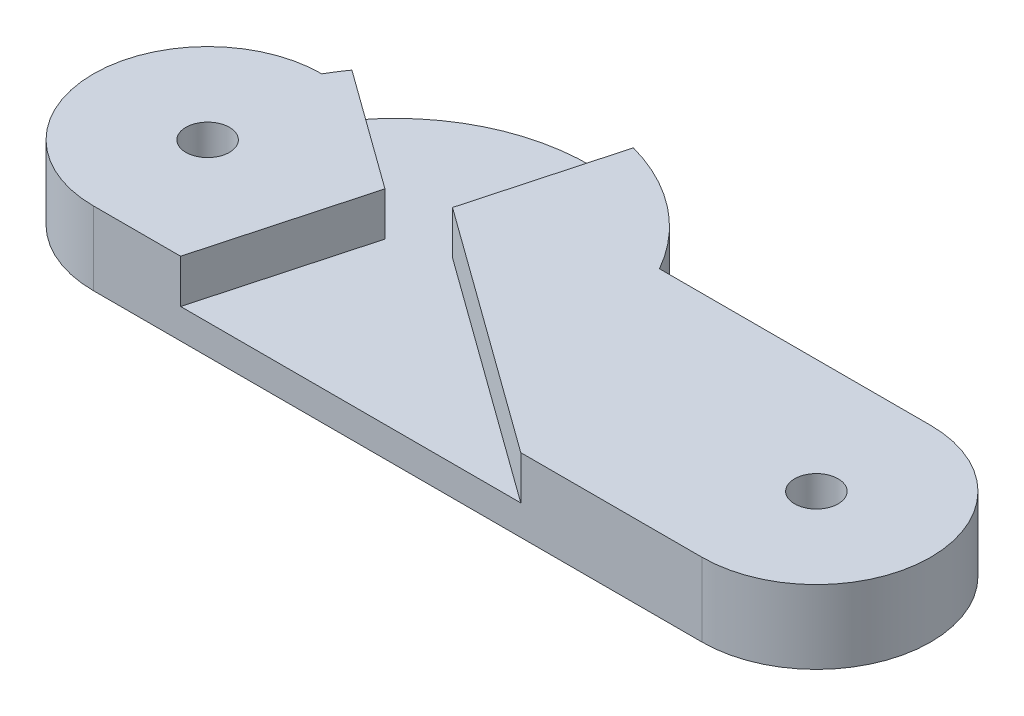
ISO-10303-21;
HEADER;
FILE_DESCRIPTION(('STEP AP214'),'2;1');
FILE_NAME('part.step','',(''),(''),'','','');
FILE_SCHEMA(('AUTOMOTIVE_DESIGN { 1 0 10303 214 1 1 1 1 }'));
ENDSEC;
DATA;
#1=APPLICATION_CONTEXT('core data for automotive mechanical design processes');
#2=APPLICATION_PROTOCOL_DEFINITION('international standard','automotive_design',2000,#1);
#3=PRODUCT_CONTEXT('',#1,'mechanical');
#4=PRODUCT('Part','Part','',(#3));
#5=PRODUCT_RELATED_PRODUCT_CATEGORY('part','',(#4));
#6=PRODUCT_DEFINITION_FORMATION('','',#4);
#7=PRODUCT_DEFINITION_CONTEXT('part definition',#1,'design');
#8=PRODUCT_DEFINITION('design','',#6,#7);
#9=PRODUCT_DEFINITION_SHAPE('','',#8);
#10=(LENGTH_UNIT() NAMED_UNIT(*) SI_UNIT(.MILLI.,.METRE.));
#11=(NAMED_UNIT(*) PLANE_ANGLE_UNIT() SI_UNIT($,.RADIAN.));
#12=(NAMED_UNIT(*) SI_UNIT($,.STERADIAN.) SOLID_ANGLE_UNIT());
#13=UNCERTAINTY_MEASURE_WITH_UNIT(LENGTH_MEASURE(1.E-05),#10,'distance_accuracy_value','');
#14=(GEOMETRIC_REPRESENTATION_CONTEXT(3) GLOBAL_UNCERTAINTY_ASSIGNED_CONTEXT((#13)) GLOBAL_UNIT_ASSIGNED_CONTEXT((#10,
#11,#12)) REPRESENTATION_CONTEXT('',''));
#15=CARTESIAN_POINT('',(0.,0.,0.));
#16=DIRECTION('',(0.,0.,1.));
#17=DIRECTION('',(1.,0.,0.));
#18=AXIS2_PLACEMENT_3D('',#15,#16,#17);
#19=CARTESIAN_POINT('',(0.,2.,0.));
#20=DIRECTION('',(0.,-1.,0.));
#21=DIRECTION('',(0.,0.,-1.));
#22=AXIS2_PLACEMENT_3D('',#19,#20,#21);
#23=PLANE('',#22);
#24=CARTESIAN_POINT('',(0.,2.,0.));
#25=DIRECTION('',(0.,-1.,0.));
#26=DIRECTION('',(0.,0.,-1.));
#27=AXIS2_PLACEMENT_3D('',#24,#25,#26);
#28=CIRCLE('',#27,2.);
#29=CARTESIAN_POINT('',(0.,2.,-2.));
#30=VERTEX_POINT('',#29);
#31=EDGE_CURVE('E48',#30,#30,#28,.T.);
#32=ORIENTED_EDGE('',*,*,#31,.T.);
#33=EDGE_LOOP('',(#32));
#34=FACE_BOUND('',#33,.T.);
#35=CARTESIAN_POINT('',(0.,2.,0.));
#36=DIRECTION('',(0.,-1.,0.));
#37=DIRECTION('',(0.,0.,-1.));
#38=AXIS2_PLACEMENT_3D('',#35,#36,#37);
#39=CIRCLE('',#38,10.5003992165423);
#40=CARTESIAN_POINT('',(0.,2.,-10.5003992165423));
#41=VERTEX_POINT('',#40);
#42=CARTESIAN_POINT('',(0.,2.,10.5003992165423));
#43=VERTEX_POINT('',#42);
#44=EDGE_CURVE('E210',#41,#43,#39,.T.);
#45=ORIENTED_EDGE('',*,*,#44,.F.);
#46=DIRECTION('',(1.,0.,0.));
#47=VECTOR('',#46,1.);
#48=CARTESIAN_POINT('',(0.,2.,-10.5003992165423));
#49=LINE('',#48,#47);
#50=CARTESIAN_POINT('',(-24.917700351162,2.,-10.5003992165423));
#51=VERTEX_POINT('',#50);
#52=EDGE_CURVE('E208',#51,#41,#49,.T.);
#53=ORIENTED_EDGE('',*,*,#52,.F.);
#54=CARTESIAN_POINT('',(-40.4241193156667,2.,-1.7460511013579));
#55=DIRECTION('',(0.,-1.,0.));
#56=DIRECTION('',(0.,0.,-1.));
#57=AXIS2_PLACEMENT_3D('',#54,#55,#56);
#58=CIRCLE('',#57,17.8069548217708);
#59=CARTESIAN_POINT('',(-35.7381547906292,2.,-18.9253810211969));
#60=VERTEX_POINT('',#59);
#61=EDGE_CURVE('E56',#60,#51,#58,.T.);
#62=ORIENTED_EDGE('',*,*,#61,.F.);
#63=DIRECTION('',(0.263153614525288,0.,-0.964753945398658));
#64=VECTOR('',#63,1.);
#65=CARTESIAN_POINT('',(-35.7518279113757,2.,-18.8752536565782));
#66=LINE('',#65,#64);
#67=CARTESIAN_POINT('',(-39.2995259463282,2.,-5.86895054165502));
#68=VERTEX_POINT('',#67);
#69=EDGE_CURVE('E142',#68,#60,#66,.T.);
#70=ORIENTED_EDGE('',*,*,#69,.F.);
#71=DIRECTION('',(-0.810372315489383,0.,-0.585915275691269));
#72=VECTOR('',#71,1.);
#73=CARTESIAN_POINT('',(26.6452391554762,2.,41.8104240945407));
#74=LINE('',#73,#72);
#75=CARTESIAN_POINT('',(-16.659276720951,2.,10.5003992165423));
#76=VERTEX_POINT('',#75);
#77=EDGE_CURVE('E155',#76,#68,#74,.T.);
#78=ORIENTED_EDGE('',*,*,#77,.F.);
#79=DIRECTION('',(-1.,0.,0.));
#80=VECTOR('',#79,1.);
#81=CARTESIAN_POINT('',(0.,2.,10.5003992165423));
#82=LINE('',#81,#80);
#83=EDGE_CURVE('E64',#43,#76,#82,.T.);
#84=ORIENTED_EDGE('',*,*,#83,.F.);
#85=EDGE_LOOP('',(#45,#53,#62,#70,#78,#84));
#86=FACE_BOUND('',#85,.T.);
#87=ADVANCED_FACE('F39',(#34,#86),#23,.F.);
#88=CARTESIAN_POINT('',(-55.9305382801715,2.,0.));
#89=DIRECTION('',(0.,-1.,0.));
#90=DIRECTION('',(0.,0.,-1.));
#91=AXIS2_PLACEMENT_3D('',#88,#89,#90);
#92=CIRCLE('',#91,2.);
#93=CARTESIAN_POINT('',(-55.9305382801715,2.,-2.));
#94=VERTEX_POINT('',#93);
#95=EDGE_CURVE('E11',#94,#94,#92,.T.);
#96=ORIENTED_EDGE('',*,*,#95,.T.);
#97=EDGE_LOOP('',(#96));
#98=FACE_BOUND('',#97,.T.);
#99=CARTESIAN_POINT('',(-55.9305382801715,2.,0.));
#100=DIRECTION('',(0.,-1.,0.));
#101=DIRECTION('',(0.,0.,-1.));
#102=AXIS2_PLACEMENT_3D('',#99,#100,#101);
#103=CIRCLE('',#102,10.5003992165423);
#104=CARTESIAN_POINT('',(-55.9305382801715,2.,10.5003992165423));
#105=VERTEX_POINT('',#104);
#106=CARTESIAN_POINT('',(-55.9305382801715,2.,-10.5003992165423));
#107=VERTEX_POINT('',#106);
#108=EDGE_CURVE('E43',#105,#107,#103,.T.);
#109=ORIENTED_EDGE('',*,*,#108,.F.);
#110=CARTESIAN_POINT('',(-47.9106890267398,2.,10.5003992165423));
#111=VERTEX_POINT('',#110);
#112=EDGE_CURVE('E212',#111,#105,#82,.T.);
#113=ORIENTED_EDGE('',*,*,#112,.F.);
#114=DIRECTION('',(-0.263153614525289,0.,0.964753945398657));
#115=VECTOR('',#114,1.);
#116=CARTESIAN_POINT('',(-43.8872651072943,2.,-4.24997427651618));
#117=LINE('',#116,#115);
#118=CARTESIAN_POINT('',(-43.8872651072943,2.,-4.24997427651618));
#119=VERTEX_POINT('',#118);
#120=EDGE_CURVE('E156',#119,#111,#117,.T.);
#121=ORIENTED_EDGE('',*,*,#120,.F.);
#122=DIRECTION('',(0.810372315489383,0.,0.585915275691269));
#123=VECTOR('',#122,1.);
#124=CARTESIAN_POINT('',(-43.8872651072943,2.,-4.24997427651618));
#125=LINE('',#124,#123);
#126=CARTESIAN_POINT('',(-54.8543825263999,2.,-12.1794179449777));
#127=VERTEX_POINT('',#126);
#128=EDGE_CURVE('E165',#127,#119,#125,.T.);
#129=ORIENTED_EDGE('',*,*,#128,.F.);
#130=EDGE_CURVE('E207',#107,#127,#58,.T.);
#131=ORIENTED_EDGE('',*,*,#130,.F.);
#132=EDGE_LOOP('',(#109,#113,#121,#129,#131));
#133=FACE_BOUND('',#132,.T.);
#134=ADVANCED_FACE('F41',(#98,#133),#23,.F.);
#135=CARTESIAN_POINT('',(-40.4241193156667,37.0570550282,-1.7460511013579));
#136=DIRECTION('',(0.,-1.,0.));
#137=DIRECTION('',(0.,0.,-1.));
#138=AXIS2_PLACEMENT_3D('',#135,#136,#137);
#139=CYLINDRICAL_SURFACE('',#138,17.8069548217708);
#140=DIRECTION('',(0.,1.,0.));
#141=VECTOR('',#140,1.);
#142=CARTESIAN_POINT('',(-35.7381547906292,-2.,-18.9253810211969));
#143=LINE('',#142,#141);
#144=CARTESIAN_POINT('',(-35.7381547906292,-2.,-18.9253810211969));
#145=VERTEX_POINT('',#144);
#146=EDGE_CURVE('E139',#145,#60,#143,.T.);
#147=ORIENTED_EDGE('',*,*,#146,.T.);
#148=ORIENTED_EDGE('',*,*,#61,.T.);
#149=DIRECTION('',(0.,-1.,0.));
#150=VECTOR('',#149,1.);
#151=CARTESIAN_POINT('',(-24.917700351162,37.0570550282,-10.5003992165423));
#152=LINE('',#151,#150);
#153=CARTESIAN_POINT('',(-24.917700351162,-4.75,-10.5003992165423));
#154=VERTEX_POINT('',#153);
#155=EDGE_CURVE('E153',#51,#154,#152,.T.);
#156=ORIENTED_EDGE('',*,*,#155,.T.);
#157=CARTESIAN_POINT('',(-40.4241193156667,-4.75,-1.7460511013579));
#158=DIRECTION('',(0.,1.,0.));
#159=DIRECTION('',(0.,0.,1.));
#160=AXIS2_PLACEMENT_3D('',#157,#158,#159);
#161=CIRCLE('',#160,17.8069548217708);
#162=CARTESIAN_POINT('',(-55.9305382801715,-4.75,-10.5003992165423));
#163=VERTEX_POINT('',#162);
#164=EDGE_CURVE('E149',#163,#154,#161,.F.);
#165=ORIENTED_EDGE('',*,*,#164,.F.);
#166=DIRECTION('',(0.,-1.,0.));
#167=VECTOR('',#166,1.);
#168=CARTESIAN_POINT('',(-55.9305382801715,4.75,-10.5003992165423));
#169=LINE('',#168,#167);
#170=EDGE_CURVE('E194',#107,#163,#169,.T.);
#171=ORIENTED_EDGE('',*,*,#170,.F.);
#172=ORIENTED_EDGE('',*,*,#130,.T.);
#173=DIRECTION('',(0.,1.,0.));
#174=VECTOR('',#173,1.);
#175=CARTESIAN_POINT('',(-54.8543825263999,-2.,-12.1794179449777));
#176=LINE('',#175,#174);
#177=CARTESIAN_POINT('',(-54.8543825263999,-2.,-12.1794179449777));
#178=VERTEX_POINT('',#177);
#179=EDGE_CURVE('E143',#178,#127,#176,.T.);
#180=ORIENTED_EDGE('',*,*,#179,.F.);
#181=CARTESIAN_POINT('',(-40.4241193156667,-2.,-1.7460511013579));
#182=DIRECTION('',(0.,1.,0.));
#183=DIRECTION('',(0.,0.,1.));
#184=AXIS2_PLACEMENT_3D('',#181,#182,#183);
#185=CIRCLE('',#184,17.8069548217708);
#186=EDGE_CURVE('E130',#145,#178,#185,.T.);
#187=ORIENTED_EDGE('',*,*,#186,.F.);
#188=EDGE_LOOP('',(#147,#148,#156,#165,#171,#172,#180,#187));
#189=FACE_BOUND('',#188,.T.);
#190=ADVANCED_FACE('F145',(#189),#139,.T.);
#191=CARTESIAN_POINT('',(0.,4.75,-10.5003992165423));
#192=DIRECTION('',(0.,0.,1.));
#193=DIRECTION('',(1.,0.,0.));
#194=AXIS2_PLACEMENT_3D('',#191,#192,#193);
#195=PLANE('',#194);
#196=ORIENTED_EDGE('',*,*,#155,.F.);
#197=ORIENTED_EDGE('',*,*,#52,.T.);
#198=DIRECTION('',(0.,-1.,0.));
#199=VECTOR('',#198,1.);
#200=CARTESIAN_POINT('',(0.,4.75,-10.5003992165423));
#201=LINE('',#200,#199);
#202=CARTESIAN_POINT('',(0.,-4.75,-10.5003992165423));
#203=VERTEX_POINT('',#202);
#204=EDGE_CURVE('E196',#41,#203,#201,.T.);
#205=ORIENTED_EDGE('',*,*,#204,.T.);
#206=DIRECTION('',(-1.,0.,0.));
#207=VECTOR('',#206,1.);
#208=CARTESIAN_POINT('',(0.,-4.75,-10.5003992165423));
#209=LINE('',#208,#207);
#210=EDGE_CURVE('E181',#203,#154,#209,.T.);
#211=ORIENTED_EDGE('',*,*,#210,.T.);
#212=EDGE_LOOP('',(#196,#197,#205,#211));
#213=FACE_BOUND('',#212,.T.);
#214=ADVANCED_FACE('F253',(#213),#195,.F.);
#215=CARTESIAN_POINT('',(0.,4.75,10.5003992165423));
#216=DIRECTION('',(0.,0.,-1.));
#217=DIRECTION('',(-1.,0.,0.));
#218=AXIS2_PLACEMENT_3D('',#215,#216,#217);
#219=PLANE('',#218);
#220=DIRECTION('',(0.,-1.,0.));
#221=VECTOR('',#220,1.);
#222=CARTESIAN_POINT('',(0.,4.75,10.5003992165423));
#223=LINE('',#222,#221);
#224=CARTESIAN_POINT('',(0.,-4.75,10.5003992165423));
#225=VERTEX_POINT('',#224);
#226=EDGE_CURVE('E190',#43,#225,#223,.T.);
#227=ORIENTED_EDGE('',*,*,#226,.F.);
#228=ORIENTED_EDGE('',*,*,#83,.T.);
#229=DIRECTION('',(0.,-1.,0.));
#230=VECTOR('',#229,1.);
#231=CARTESIAN_POINT('',(-16.659276720951,4.75,10.5003992165423));
#232=LINE('',#231,#230);
#233=CARTESIAN_POINT('',(-16.659276720951,-2.,10.5003992165423));
#234=VERTEX_POINT('',#233);
#235=EDGE_CURVE('E201',#76,#234,#232,.T.);
#236=ORIENTED_EDGE('',*,*,#235,.T.);
#237=DIRECTION('',(1.,0.,0.));
#238=VECTOR('',#237,1.);
#239=CARTESIAN_POINT('',(0.,-2.,10.5003992165423));
#240=LINE('',#239,#238);
#241=CARTESIAN_POINT('',(-47.9106890267398,-2.,10.5003992165423));
#242=VERTEX_POINT('',#241);
#243=EDGE_CURVE('E204',#242,#234,#240,.T.);
#244=ORIENTED_EDGE('',*,*,#243,.F.);
#245=DIRECTION('',(0.,1.,0.));
#246=VECTOR('',#245,1.);
#247=CARTESIAN_POINT('',(-47.9106890267398,4.75,10.5003992165423));
#248=LINE('',#247,#246);
#249=EDGE_CURVE('E198',#242,#111,#248,.T.);
#250=ORIENTED_EDGE('',*,*,#249,.T.);
#251=ORIENTED_EDGE('',*,*,#112,.T.);
#252=DIRECTION('',(0.,-1.,0.));
#253=VECTOR('',#252,1.);
#254=CARTESIAN_POINT('',(-55.9305382801715,4.75,10.5003992165423));
#255=LINE('',#254,#253);
#256=CARTESIAN_POINT('',(-55.9305382801715,-4.75,10.5003992165423));
#257=VERTEX_POINT('',#256);
#258=EDGE_CURVE('E192',#105,#257,#255,.T.);
#259=ORIENTED_EDGE('',*,*,#258,.T.);
#260=DIRECTION('',(1.,0.,0.));
#261=VECTOR('',#260,1.);
#262=CARTESIAN_POINT('',(0.,-4.75,10.5003992165423));
#263=LINE('',#262,#261);
#264=EDGE_CURVE('E187',#257,#225,#263,.T.);
#265=ORIENTED_EDGE('',*,*,#264,.T.);
#266=EDGE_LOOP('',(#227,#228,#236,#244,#250,#251,#259,#265));
#267=FACE_BOUND('',#266,.T.);
#268=ADVANCED_FACE('F229',(#267),#219,.F.);
#269=CARTESIAN_POINT('',(0.,-4.75,0.));
#270=DIRECTION('',(0.,1.,0.));
#271=DIRECTION('',(0.,0.,1.));
#272=AXIS2_PLACEMENT_3D('',#269,#270,#271);
#273=PLANE('',#272);
#274=CARTESIAN_POINT('',(0.,-4.75,0.));
#275=DIRECTION('',(0.,1.,0.));
#276=DIRECTION('',(0.,0.,1.));
#277=AXIS2_PLACEMENT_3D('',#274,#275,#276);
#278=CIRCLE('',#277,10.5003992165423);
#279=EDGE_CURVE('E178',#225,#203,#278,.T.);
#280=ORIENTED_EDGE('',*,*,#279,.F.);
#281=ORIENTED_EDGE('',*,*,#264,.F.);
#282=CARTESIAN_POINT('',(-55.9305382801715,-4.75,0.));
#283=DIRECTION('',(0.,1.,0.));
#284=DIRECTION('',(0.,0.,1.));
#285=AXIS2_PLACEMENT_3D('',#282,#283,#284);
#286=CIRCLE('',#285,10.5003992165423);
#287=EDGE_CURVE('E184',#163,#257,#286,.T.);
#288=ORIENTED_EDGE('',*,*,#287,.F.);
#289=ORIENTED_EDGE('',*,*,#164,.T.);
#290=ORIENTED_EDGE('',*,*,#210,.F.);
#291=EDGE_LOOP('',(#280,#281,#288,#289,#290));
#292=FACE_BOUND('',#291,.T.);
#293=CARTESIAN_POINT('',(0.,-4.75,0.));
#294=DIRECTION('',(0.,1.,0.));
#295=DIRECTION('',(0.,0.,1.));
#296=AXIS2_PLACEMENT_3D('',#293,#294,#295);
#297=CIRCLE('',#296,2.);
#298=CARTESIAN_POINT('',(0.,-4.75,2.));
#299=VERTEX_POINT('',#298);
#300=EDGE_CURVE('E175',#299,#299,#297,.T.);
#301=ORIENTED_EDGE('',*,*,#300,.T.);
#302=EDGE_LOOP('',(#301));
#303=FACE_BOUND('',#302,.T.);
#304=CARTESIAN_POINT('',(-55.9305382801715,-4.75,0.));
#305=DIRECTION('',(0.,1.,0.));
#306=DIRECTION('',(0.,0.,1.));
#307=AXIS2_PLACEMENT_3D('',#304,#305,#306);
#308=CIRCLE('',#307,2.);
#309=CARTESIAN_POINT('',(-55.9305382801715,-4.75,2.));
#310=VERTEX_POINT('',#309);
#311=EDGE_CURVE('E171',#310,#310,#308,.T.);
#312=ORIENTED_EDGE('',*,*,#311,.T.);
#313=EDGE_LOOP('',(#312));
#314=FACE_BOUND('',#313,.T.);
#315=ADVANCED_FACE('F225',(#292,#303,#314),#273,.F.);
#316=CARTESIAN_POINT('',(0.,4.75,0.));
#317=DIRECTION('',(0.,-1.,0.));
#318=DIRECTION('',(0.,0.,-1.));
#319=AXIS2_PLACEMENT_3D('',#316,#317,#318);
#320=CYLINDRICAL_SURFACE('',#319,10.5003992165423);
#321=ORIENTED_EDGE('',*,*,#204,.F.);
#322=ORIENTED_EDGE('',*,*,#44,.T.);
#323=ORIENTED_EDGE('',*,*,#226,.T.);
#324=ORIENTED_EDGE('',*,*,#279,.T.);
#325=EDGE_LOOP('',(#321,#322,#323,#324));
#326=FACE_BOUND('',#325,.T.);
#327=ADVANCED_FACE('F228',(#326),#320,.T.);
#328=CARTESIAN_POINT('',(-55.9305382801715,4.75,0.));
#329=DIRECTION('',(0.,-1.,0.));
#330=DIRECTION('',(0.,0.,-1.));
#331=AXIS2_PLACEMENT_3D('',#328,#329,#330);
#332=CYLINDRICAL_SURFACE('',#331,10.5003992165423);
#333=ORIENTED_EDGE('',*,*,#258,.F.);
#334=ORIENTED_EDGE('',*,*,#108,.T.);
#335=ORIENTED_EDGE('',*,*,#170,.T.);
#336=ORIENTED_EDGE('',*,*,#287,.T.);
#337=EDGE_LOOP('',(#333,#334,#335,#336));
#338=FACE_BOUND('',#337,.T.);
#339=ADVANCED_FACE('F221',(#338),#332,.T.);
#340=CARTESIAN_POINT('',(0.,4.75,0.));
#341=DIRECTION('',(0.,-1.,0.));
#342=DIRECTION('',(0.,0.,-1.));
#343=AXIS2_PLACEMENT_3D('',#340,#341,#342);
#344=CYLINDRICAL_SURFACE('',#343,2.);
#345=ORIENTED_EDGE('',*,*,#31,.F.);
#346=EDGE_LOOP('',(#345));
#347=FACE_BOUND('',#346,.T.);
#348=ORIENTED_EDGE('',*,*,#300,.F.);
#349=EDGE_LOOP('',(#348));
#350=FACE_BOUND('',#349,.T.);
#351=ADVANCED_FACE('F217',(#347,#350),#344,.F.);
#352=CARTESIAN_POINT('',(-55.9305382801715,4.75,0.));
#353=DIRECTION('',(0.,-1.,0.));
#354=DIRECTION('',(0.,0.,-1.));
#355=AXIS2_PLACEMENT_3D('',#352,#353,#354);
#356=CYLINDRICAL_SURFACE('',#355,2.);
#357=ORIENTED_EDGE('',*,*,#95,.F.);
#358=EDGE_LOOP('',(#357));
#359=FACE_BOUND('',#358,.T.);
#360=ORIENTED_EDGE('',*,*,#311,.F.);
#361=EDGE_LOOP('',(#360));
#362=FACE_BOUND('',#361,.T.);
#363=ADVANCED_FACE('F220',(#359,#362),#356,.F.);
#364=CARTESIAN_POINT('',(-43.8872651072943,-2.,-4.24997427651618));
#365=DIRECTION('',(-0.585915275691269,0.,0.810372315489383));
#366=DIRECTION('',(0.810372315489383,0.,0.585915275691269));
#367=AXIS2_PLACEMENT_3D('',#364,#365,#366);
#368=PLANE('',#367);
#369=ORIENTED_EDGE('',*,*,#128,.T.);
#370=DIRECTION('',(0.,1.,0.));
#371=VECTOR('',#370,1.);
#372=CARTESIAN_POINT('',(-43.8872651072943,-2.,-4.24997427651618));
#373=LINE('',#372,#371);
#374=CARTESIAN_POINT('',(-43.8872651072943,-2.,-4.24997427651618));
#375=VERTEX_POINT('',#374);
#376=EDGE_CURVE('E168',#375,#119,#373,.T.);
#377=ORIENTED_EDGE('',*,*,#376,.F.);
#378=DIRECTION('',(0.810372315489383,0.,0.585915275691269));
#379=VECTOR('',#378,1.);
#380=CARTESIAN_POINT('',(-43.8872651072943,-2.,-4.24997427651618));
#381=LINE('',#380,#379);
#382=EDGE_CURVE('E137',#178,#375,#381,.T.);
#383=ORIENTED_EDGE('',*,*,#382,.F.);
#384=ORIENTED_EDGE('',*,*,#179,.T.);
#385=EDGE_LOOP('',(#369,#377,#383,#384));
#386=FACE_BOUND('',#385,.T.);
#387=ADVANCED_FACE('F235',(#386),#368,.F.);
#388=CARTESIAN_POINT('',(-35.7518279113757,-2.,-18.8752536565782));
#389=DIRECTION('',(0.964753945398658,0.,0.263153614525288));
#390=DIRECTION('',(0.263153614525288,0.,-0.964753945398658));
#391=AXIS2_PLACEMENT_3D('',#388,#389,#390);
#392=PLANE('',#391);
#393=DIRECTION('',(0.263153614525288,0.,-0.964753945398658));
#394=VECTOR('',#393,1.);
#395=CARTESIAN_POINT('',(-35.7518279113757,-2.,-18.8752536565782));
#396=LINE('',#395,#394);
#397=CARTESIAN_POINT('',(-39.2995259463282,-2.,-5.86895054165502));
#398=VERTEX_POINT('',#397);
#399=EDGE_CURVE('E126',#398,#145,#396,.T.);
#400=ORIENTED_EDGE('',*,*,#399,.F.);
#401=DIRECTION('',(0.,1.,0.));
#402=VECTOR('',#401,1.);
#403=CARTESIAN_POINT('',(-39.2995259463282,-2.,-5.86895054165502));
#404=LINE('',#403,#402);
#405=EDGE_CURVE('E162',#398,#68,#404,.T.);
#406=ORIENTED_EDGE('',*,*,#405,.T.);
#407=ORIENTED_EDGE('',*,*,#69,.T.);
#408=ORIENTED_EDGE('',*,*,#146,.F.);
#409=EDGE_LOOP('',(#400,#406,#407,#408));
#410=FACE_BOUND('',#409,.T.);
#411=ADVANCED_FACE('F140',(#410),#392,.F.);
#412=CARTESIAN_POINT('',(26.6452391554762,-2.,41.8104240945407));
#413=DIRECTION('',(0.585915275691269,0.,-0.810372315489383));
#414=DIRECTION('',(-0.810372315489383,0.,-0.585915275691269));
#415=AXIS2_PLACEMENT_3D('',#412,#413,#414);
#416=PLANE('',#415);
#417=ORIENTED_EDGE('',*,*,#77,.T.);
#418=ORIENTED_EDGE('',*,*,#405,.F.);
#419=DIRECTION('',(-0.810372315489383,0.,-0.585915275691269));
#420=VECTOR('',#419,1.);
#421=CARTESIAN_POINT('',(26.6452391554762,-2.,41.8104240945407));
#422=LINE('',#421,#420);
#423=EDGE_CURVE('E133',#234,#398,#422,.T.);
#424=ORIENTED_EDGE('',*,*,#423,.F.);
#425=ORIENTED_EDGE('',*,*,#235,.F.);
#426=EDGE_LOOP('',(#417,#418,#424,#425));
#427=FACE_BOUND('',#426,.T.);
#428=ADVANCED_FACE('F262',(#427),#416,.F.);
#429=CARTESIAN_POINT('',(-43.8872651072943,-2.,-4.24997427651618));
#430=DIRECTION('',(-0.964753945398657,0.,-0.263153614525289));
#431=DIRECTION('',(-0.263153614525289,0.,0.964753945398657));
#432=AXIS2_PLACEMENT_3D('',#429,#430,#431);
#433=PLANE('',#432);
#434=DIRECTION('',(-0.263153614525289,0.,0.964753945398657));
#435=VECTOR('',#434,1.);
#436=CARTESIAN_POINT('',(-43.8872651072943,-2.,-4.24997427651618));
#437=LINE('',#436,#435);
#438=EDGE_CURVE('E159',#375,#242,#437,.T.);
#439=ORIENTED_EDGE('',*,*,#438,.F.);
#440=ORIENTED_EDGE('',*,*,#376,.T.);
#441=ORIENTED_EDGE('',*,*,#120,.T.);
#442=ORIENTED_EDGE('',*,*,#249,.F.);
#443=EDGE_LOOP('',(#439,#440,#441,#442));
#444=FACE_BOUND('',#443,.T.);
#445=ADVANCED_FACE('F257',(#444),#433,.F.);
#446=CARTESIAN_POINT('',(-41.5933955268113,-2.,-5.05946240908561));
#447=DIRECTION('',(0.,1.,0.));
#448=DIRECTION('',(0.,0.,1.));
#449=AXIS2_PLACEMENT_3D('',#446,#447,#448);
#450=PLANE('',#449);
#451=ORIENTED_EDGE('',*,*,#399,.T.);
#452=ORIENTED_EDGE('',*,*,#186,.T.);
#453=ORIENTED_EDGE('',*,*,#382,.T.);
#454=ORIENTED_EDGE('',*,*,#438,.T.);
#455=ORIENTED_EDGE('',*,*,#243,.T.);
#456=ORIENTED_EDGE('',*,*,#423,.T.);
#457=EDGE_LOOP('',(#451,#452,#453,#454,#455,#456));
#458=FACE_BOUND('',#457,.T.);
#459=ADVANCED_FACE('F128',(#458),#450,.T.);
#460=CLOSED_SHELL('',(#87,#134,#190,#214,#268,#315,#327,#339,#351,#363,#387,#411,#428,#445,#459));
#461=MANIFOLD_SOLID_BREP('B2',#460);
#462=ADVANCED_BREP_SHAPE_REPRESENTATION('',(#18,#461),#14);
#463=SHAPE_DEFINITION_REPRESENTATION(#9,#462);
ENDSEC;
END-ISO-10303-21;
